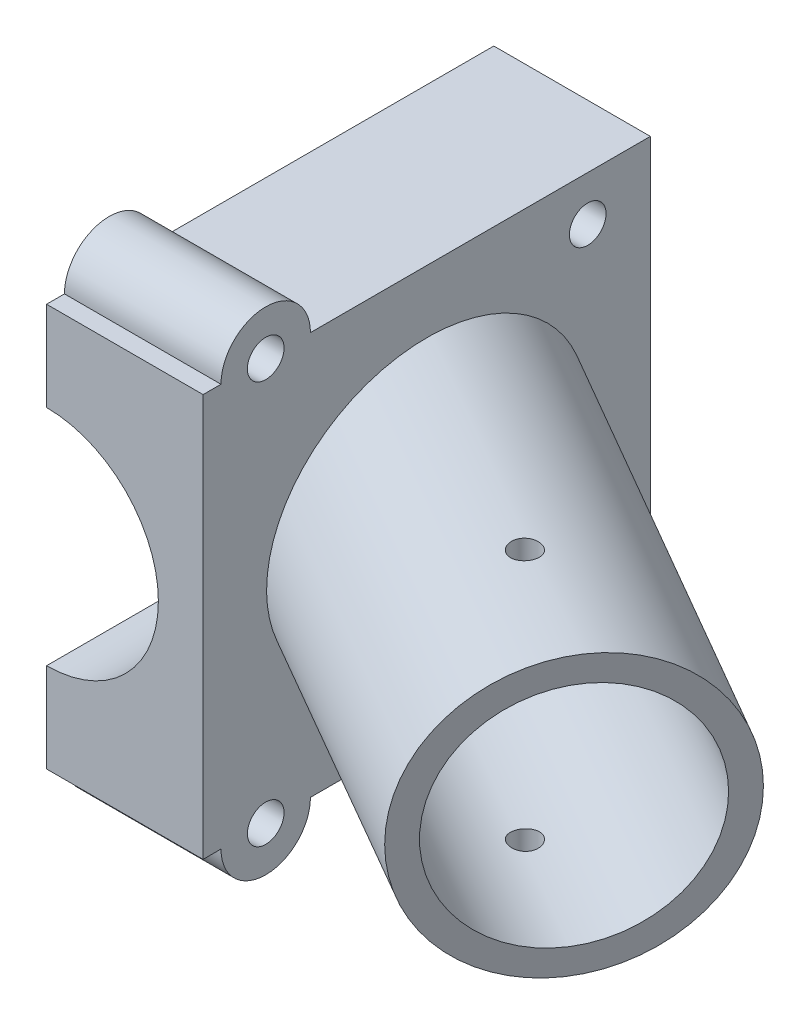
ISO-10303-21;
HEADER;
FILE_DESCRIPTION(('STEP AP214'),'2;1');
FILE_NAME('part.step','',(''),(''),'','','');
FILE_SCHEMA(('AUTOMOTIVE_DESIGN { 1 0 10303 214 1 1 1 1 }'));
ENDSEC;
DATA;
#1=APPLICATION_CONTEXT('core data for automotive mechanical design processes');
#2=APPLICATION_PROTOCOL_DEFINITION('international standard','automotive_design',2000,#1);
#3=PRODUCT_CONTEXT('',#1,'mechanical');
#4=PRODUCT('Part','Part','',(#3));
#5=PRODUCT_RELATED_PRODUCT_CATEGORY('part','',(#4));
#6=PRODUCT_DEFINITION_FORMATION('','',#4);
#7=PRODUCT_DEFINITION_CONTEXT('part definition',#1,'design');
#8=PRODUCT_DEFINITION('design','',#6,#7);
#9=PRODUCT_DEFINITION_SHAPE('','',#8);
#10=(LENGTH_UNIT() NAMED_UNIT(*) SI_UNIT(.MILLI.,.METRE.));
#11=(NAMED_UNIT(*) PLANE_ANGLE_UNIT() SI_UNIT($,.RADIAN.));
#12=(NAMED_UNIT(*) SI_UNIT($,.STERADIAN.) SOLID_ANGLE_UNIT());
#13=UNCERTAINTY_MEASURE_WITH_UNIT(LENGTH_MEASURE(1.E-05),#10,'distance_accuracy_value','');
#14=(GEOMETRIC_REPRESENTATION_CONTEXT(3) GLOBAL_UNCERTAINTY_ASSIGNED_CONTEXT((#13)) GLOBAL_UNIT_ASSIGNED_CONTEXT((#10,
#11,#12)) REPRESENTATION_CONTEXT('',''));
#15=CARTESIAN_POINT('',(0.,0.,0.));
#16=DIRECTION('',(0.,0.,1.));
#17=DIRECTION('',(1.,0.,0.));
#18=AXIS2_PLACEMENT_3D('',#15,#16,#17);
#19=CARTESIAN_POINT('',(-17.5,45.,25.));
#20=DIRECTION('',(0.,1.,0.));
#21=DIRECTION('',(0.,0.,1.));
#22=AXIS2_PLACEMENT_3D('',#19,#20,#21);
#23=PLANE('',#22);
#24=DIRECTION('',(0.,0.,1.));
#25=VECTOR('',#24,1.);
#26=CARTESIAN_POINT('',(0.,45.,-25.));
#27=LINE('',#26,#25);
#28=CARTESIAN_POINT('',(0.,45.,-25.));
#29=VERTEX_POINT('',#28);
#30=CARTESIAN_POINT('',(0.,45.,13.));
#31=VERTEX_POINT('',#30);
#32=EDGE_CURVE('E122',#29,#31,#27,.T.);
#33=ORIENTED_EDGE('',*,*,#32,.T.);
#34=DIRECTION('',(-1.,0.,0.));
#35=VECTOR('',#34,1.);
#36=CARTESIAN_POINT('',(17.5,45.,13.));
#37=LINE('',#36,#35);
#38=CARTESIAN_POINT('',(17.5,45.,13.));
#39=VERTEX_POINT('',#38);
#40=EDGE_CURVE('E52',#39,#31,#37,.T.);
#41=ORIENTED_EDGE('',*,*,#40,.F.);
#42=DIRECTION('',(0.,0.,-1.));
#43=VECTOR('',#42,1.);
#44=CARTESIAN_POINT('',(17.5,45.,25.));
#45=LINE('',#44,#43);
#46=CARTESIAN_POINT('',(17.5,45.,-25.));
#47=VERTEX_POINT('',#46);
#48=EDGE_CURVE('E284',#39,#47,#45,.T.);
#49=ORIENTED_EDGE('',*,*,#48,.T.);
#50=DIRECTION('',(1.,0.,0.));
#51=VECTOR('',#50,1.);
#52=CARTESIAN_POINT('',(-17.5,45.,-25.));
#53=LINE('',#52,#51);
#54=EDGE_CURVE('E240',#29,#47,#53,.T.);
#55=ORIENTED_EDGE('',*,*,#54,.F.);
#56=EDGE_LOOP('',(#33,#41,#49,#55));
#57=FACE_BOUND('',#56,.T.);
#58=ADVANCED_FACE('F35',(#57),#23,.T.);
#59=CARTESIAN_POINT('',(17.5,45.,25.));
#60=VERTEX_POINT('',#59);
#61=CARTESIAN_POINT('',(17.5,45.,23.));
#62=VERTEX_POINT('',#61);
#63=EDGE_CURVE('E60',#60,#62,#45,.T.);
#64=ORIENTED_EDGE('',*,*,#63,.T.);
#65=DIRECTION('',(-1.,0.,0.));
#66=VECTOR('',#65,1.);
#67=CARTESIAN_POINT('',(17.5,45.,23.));
#68=LINE('',#67,#66);
#69=CARTESIAN_POINT('',(0.,45.,23.));
#70=VERTEX_POINT('',#69);
#71=EDGE_CURVE('E126',#62,#70,#68,.T.);
#72=ORIENTED_EDGE('',*,*,#71,.T.);
#73=CARTESIAN_POINT('',(0.,45.,25.));
#74=VERTEX_POINT('',#73);
#75=EDGE_CURVE('E115',#70,#74,#27,.T.);
#76=ORIENTED_EDGE('',*,*,#75,.T.);
#77=DIRECTION('',(1.,0.,0.));
#78=VECTOR('',#77,1.);
#79=CARTESIAN_POINT('',(-17.5,45.,25.));
#80=LINE('',#79,#78);
#81=EDGE_CURVE('E286',#74,#60,#80,.T.);
#82=ORIENTED_EDGE('',*,*,#81,.T.);
#83=EDGE_LOOP('',(#64,#72,#76,#82));
#84=FACE_BOUND('',#83,.T.);
#85=ADVANCED_FACE('F127',(#84),#23,.T.);
#86=CARTESIAN_POINT('',(-17.5,0.,25.));
#87=DIRECTION('',(0.,1.,0.));
#88=DIRECTION('',(0.,0.,1.));
#89=AXIS2_PLACEMENT_3D('',#86,#87,#88);
#90=PLANE('',#89);
#91=DIRECTION('',(0.,0.,-1.));
#92=VECTOR('',#91,1.);
#93=CARTESIAN_POINT('',(17.5,0.,25.));
#94=LINE('',#93,#92);
#95=CARTESIAN_POINT('',(17.5,0.,13.));
#96=VERTEX_POINT('',#95);
#97=CARTESIAN_POINT('',(17.5,0.,-25.));
#98=VERTEX_POINT('',#97);
#99=EDGE_CURVE('E44',#96,#98,#94,.T.);
#100=ORIENTED_EDGE('',*,*,#99,.F.);
#101=DIRECTION('',(-1.,0.,0.));
#102=VECTOR('',#101,1.);
#103=CARTESIAN_POINT('',(17.5,0.,13.));
#104=LINE('',#103,#102);
#105=CARTESIAN_POINT('',(0.,0.,13.));
#106=VERTEX_POINT('',#105);
#107=EDGE_CURVE('E154',#96,#106,#104,.T.);
#108=ORIENTED_EDGE('',*,*,#107,.T.);
#109=DIRECTION('',(0.,0.,-1.));
#110=VECTOR('',#109,1.);
#111=CARTESIAN_POINT('',(0.,0.,-25.));
#112=LINE('',#111,#110);
#113=CARTESIAN_POINT('',(0.,0.,-25.));
#114=VERTEX_POINT('',#113);
#115=EDGE_CURVE('E164',#106,#114,#112,.T.);
#116=ORIENTED_EDGE('',*,*,#115,.T.);
#117=DIRECTION('',(1.,0.,0.));
#118=VECTOR('',#117,1.);
#119=CARTESIAN_POINT('',(-17.5,0.,-25.));
#120=LINE('',#119,#118);
#121=EDGE_CURVE('E258',#114,#98,#120,.T.);
#122=ORIENTED_EDGE('',*,*,#121,.T.);
#123=EDGE_LOOP('',(#100,#108,#116,#122));
#124=FACE_BOUND('',#123,.T.);
#125=ADVANCED_FACE('F237',(#124),#90,.F.);
#126=CARTESIAN_POINT('',(0.,0.,25.));
#127=VERTEX_POINT('',#126);
#128=CARTESIAN_POINT('',(0.,0.,23.));
#129=VERTEX_POINT('',#128);
#130=EDGE_CURVE('E165',#127,#129,#112,.T.);
#131=ORIENTED_EDGE('',*,*,#130,.T.);
#132=DIRECTION('',(-1.,0.,0.));
#133=VECTOR('',#132,1.);
#134=CARTESIAN_POINT('',(17.5,0.,23.));
#135=LINE('',#134,#133);
#136=CARTESIAN_POINT('',(17.5,0.,23.));
#137=VERTEX_POINT('',#136);
#138=EDGE_CURVE('E151',#137,#129,#135,.T.);
#139=ORIENTED_EDGE('',*,*,#138,.F.);
#140=CARTESIAN_POINT('',(17.5,0.,25.));
#141=VERTEX_POINT('',#140);
#142=EDGE_CURVE('E11',#141,#137,#94,.T.);
#143=ORIENTED_EDGE('',*,*,#142,.F.);
#144=DIRECTION('',(1.,0.,0.));
#145=VECTOR('',#144,1.);
#146=CARTESIAN_POINT('',(-17.5,0.,25.));
#147=LINE('',#146,#145);
#148=EDGE_CURVE('E253',#127,#141,#147,.T.);
#149=ORIENTED_EDGE('',*,*,#148,.F.);
#150=EDGE_LOOP('',(#131,#139,#143,#149));
#151=FACE_BOUND('',#150,.T.);
#152=ADVANCED_FACE('F37',(#151),#90,.F.);
#153=CARTESIAN_POINT('',(0.,22.5,25.));
#154=DIRECTION('',(0.,0.,-1.));
#155=DIRECTION('',(-1.,0.,0.));
#156=AXIS2_PLACEMENT_3D('',#153,#154,#155);
#157=CYLINDRICAL_SURFACE('',#156,12.5);
#158=DIRECTION('',(0.,0.,-1.));
#159=VECTOR('',#158,1.);
#160=CARTESIAN_POINT('',(0.,35.,25.));
#161=LINE('',#160,#159);
#162=CARTESIAN_POINT('',(0.,35.,-25.));
#163=VERTEX_POINT('',#162);
#164=CARTESIAN_POINT('',(0.,35.,25.));
#165=VERTEX_POINT('',#164);
#166=EDGE_CURVE('E172',#163,#165,#161,.F.);
#167=ORIENTED_EDGE('',*,*,#166,.F.);
#168=CARTESIAN_POINT('',(0.,22.5,-25.));
#169=DIRECTION('',(0.,0.,-1.));
#170=DIRECTION('',(1.,0.,0.));
#171=AXIS2_PLACEMENT_3D('',#168,#169,#170);
#172=CIRCLE('',#171,12.5);
#173=CARTESIAN_POINT('',(0.,10.,-25.));
#174=VERTEX_POINT('',#173);
#175=EDGE_CURVE('E248',#163,#174,#172,.T.);
#176=ORIENTED_EDGE('',*,*,#175,.T.);
#177=DIRECTION('',(0.,0.,-1.));
#178=VECTOR('',#177,1.);
#179=CARTESIAN_POINT('',(0.,10.,25.));
#180=LINE('',#179,#178);
#181=CARTESIAN_POINT('',(0.,10.,25.));
#182=VERTEX_POINT('',#181);
#183=EDGE_CURVE('E170',#182,#174,#180,.T.);
#184=ORIENTED_EDGE('',*,*,#183,.F.);
#185=CARTESIAN_POINT('',(0.,22.5,25.));
#186=DIRECTION('',(0.,0.,-1.));
#187=DIRECTION('',(1.,0.,0.));
#188=AXIS2_PLACEMENT_3D('',#185,#186,#187);
#189=CIRCLE('',#188,12.5);
#190=EDGE_CURVE('E264',#165,#182,#189,.T.);
#191=ORIENTED_EDGE('',*,*,#190,.F.);
#192=EDGE_LOOP('',(#167,#176,#184,#191));
#193=FACE_BOUND('',#192,.T.);
#194=ADVANCED_FACE('F422',(#193),#157,.F.);
#195=CARTESIAN_POINT('',(0.,22.5,25.));
#196=DIRECTION('',(0.,0.,1.));
#197=DIRECTION('',(1.,0.,0.));
#198=AXIS2_PLACEMENT_3D('',#195,#196,#197);
#199=PLANE('',#198);
#200=ORIENTED_EDGE('',*,*,#81,.F.);
#201=DIRECTION('',(0.,-1.,0.));
#202=VECTOR('',#201,1.);
#203=CARTESIAN_POINT('',(0.,45.,25.));
#204=LINE('',#203,#202);
#205=EDGE_CURVE('E120',#74,#165,#204,.T.);
#206=ORIENTED_EDGE('',*,*,#205,.T.);
#207=ORIENTED_EDGE('',*,*,#190,.T.);
#208=EDGE_CURVE('E162',#182,#127,#204,.T.);
#209=ORIENTED_EDGE('',*,*,#208,.T.);
#210=ORIENTED_EDGE('',*,*,#148,.T.);
#211=DIRECTION('',(0.,1.,0.));
#212=VECTOR('',#211,1.);
#213=CARTESIAN_POINT('',(17.5,0.,25.));
#214=LINE('',#213,#212);
#215=EDGE_CURVE('E256',#141,#60,#214,.T.);
#216=ORIENTED_EDGE('',*,*,#215,.T.);
#217=EDGE_LOOP('',(#200,#206,#207,#209,#210,#216));
#218=FACE_BOUND('',#217,.T.);
#219=ADVANCED_FACE('F431',(#218),#199,.T.);
#220=CARTESIAN_POINT('',(0.,22.5,-25.));
#221=DIRECTION('',(0.,0.,1.));
#222=DIRECTION('',(1.,0.,0.));
#223=AXIS2_PLACEMENT_3D('',#220,#221,#222);
#224=PLANE('',#223);
#225=DIRECTION('',(0.,1.,0.));
#226=VECTOR('',#225,1.);
#227=CARTESIAN_POINT('',(0.,45.,-25.));
#228=LINE('',#227,#226);
#229=EDGE_CURVE('E157',#163,#29,#228,.T.);
#230=ORIENTED_EDGE('',*,*,#229,.T.);
#231=ORIENTED_EDGE('',*,*,#54,.T.);
#232=DIRECTION('',(0.,1.,0.));
#233=VECTOR('',#232,1.);
#234=CARTESIAN_POINT('',(17.5,0.,-25.));
#235=LINE('',#234,#233);
#236=EDGE_CURVE('E254',#98,#47,#235,.T.);
#237=ORIENTED_EDGE('',*,*,#236,.F.);
#238=ORIENTED_EDGE('',*,*,#121,.F.);
#239=EDGE_CURVE('E123',#114,#174,#228,.T.);
#240=ORIENTED_EDGE('',*,*,#239,.T.);
#241=ORIENTED_EDGE('',*,*,#175,.F.);
#242=EDGE_LOOP('',(#230,#231,#237,#238,#240,#241));
#243=FACE_BOUND('',#242,.T.);
#244=ADVANCED_FACE('F229',(#243),#224,.F.);
#245=CARTESIAN_POINT('',(23.2982756057297,5.,-18.));
#246=DIRECTION('',(-1.,0.,0.));
#247=DIRECTION('',(0.,0.,1.));
#248=AXIS2_PLACEMENT_3D('',#245,#246,#247);
#249=CYLINDRICAL_SURFACE('',#248,2.05);
#250=CARTESIAN_POINT('',(17.5,5.,-18.));
#251=DIRECTION('',(-1.,0.,0.));
#252=DIRECTION('',(0.,0.,1.));
#253=AXIS2_PLACEMENT_3D('',#250,#251,#252);
#254=CIRCLE('',#253,2.05);
#255=CARTESIAN_POINT('',(17.5,5.,-15.95));
#256=VERTEX_POINT('',#255);
#257=EDGE_CURVE('E277',#256,#256,#254,.F.);
#258=ORIENTED_EDGE('',*,*,#257,.T.);
#259=EDGE_LOOP('',(#258));
#260=FACE_BOUND('',#259,.T.);
#261=CARTESIAN_POINT('',(0.,5.,-18.));
#262=DIRECTION('',(-1.,0.,0.));
#263=DIRECTION('',(0.,0.,1.));
#264=AXIS2_PLACEMENT_3D('',#261,#262,#263);
#265=CIRCLE('',#264,2.05);
#266=CARTESIAN_POINT('',(0.,5.,-15.95));
#267=VERTEX_POINT('',#266);
#268=EDGE_CURVE('E167',#267,#267,#265,.F.);
#269=ORIENTED_EDGE('',*,*,#268,.F.);
#270=EDGE_LOOP('',(#269));
#271=FACE_BOUND('',#270,.T.);
#272=ADVANCED_FACE('F226',(#260,#271),#249,.F.);
#273=CARTESIAN_POINT('',(23.2982756057297,40.,-18.));
#274=DIRECTION('',(-1.,0.,0.));
#275=DIRECTION('',(0.,0.,1.));
#276=AXIS2_PLACEMENT_3D('',#273,#274,#275);
#277=CYLINDRICAL_SURFACE('',#276,2.05);
#278=CARTESIAN_POINT('',(17.5,40.,-18.));
#279=DIRECTION('',(-1.,0.,0.));
#280=DIRECTION('',(0.,0.,1.));
#281=AXIS2_PLACEMENT_3D('',#278,#279,#280);
#282=CIRCLE('',#281,2.05);
#283=CARTESIAN_POINT('',(17.5,40.,-15.95));
#284=VERTEX_POINT('',#283);
#285=EDGE_CURVE('E287',#284,#284,#282,.T.);
#286=ORIENTED_EDGE('',*,*,#285,.F.);
#287=EDGE_LOOP('',(#286));
#288=FACE_BOUND('',#287,.T.);
#289=CARTESIAN_POINT('',(0.,40.,-18.));
#290=DIRECTION('',(-1.,0.,0.));
#291=DIRECTION('',(0.,0.,1.));
#292=AXIS2_PLACEMENT_3D('',#289,#290,#291);
#293=CIRCLE('',#292,2.05);
#294=CARTESIAN_POINT('',(0.,40.,-15.95));
#295=VERTEX_POINT('',#294);
#296=EDGE_CURVE('E39',#295,#295,#293,.T.);
#297=ORIENTED_EDGE('',*,*,#296,.T.);
#298=EDGE_LOOP('',(#297));
#299=FACE_BOUND('',#298,.T.);
#300=ADVANCED_FACE('F201',(#288,#299),#277,.F.);
#301=CARTESIAN_POINT('',(56.4711431702997,22.5,22.5000000000001));
#302=DIRECTION('',(-0.866025403784438,0.,-0.500000000000001));
#303=DIRECTION('',(-0.500000000000001,0.,0.866025403784438));
#304=AXIS2_PLACEMENT_3D('',#301,#302,#303);
#305=CYLINDRICAL_SURFACE('',#304,15.5);
#306=CARTESIAN_POINT('',(17.5,22.5,0.));
#307=DIRECTION('',(-1.,0.,0.));
#308=DIRECTION('',(0.,0.,1.));
#309=AXIS2_PLACEMENT_3D('',#306,#307,#308);
#310=ELLIPSE('',#309,17.8978583448784,15.5);
#311=CARTESIAN_POINT('',(17.5,22.5,17.8978583448784));
#312=VERTEX_POINT('',#311);
#313=EDGE_CURVE('E274',#312,#312,#310,.F.);
#314=ORIENTED_EDGE('',*,*,#313,.T.);
#315=EDGE_LOOP('',(#314));
#316=FACE_BOUND('',#315,.T.);
#317=CARTESIAN_POINT('',(56.4711431702997,22.5,22.5000000000001));
#318=DIRECTION('',(0.866025403784438,0.,0.500000000000001));
#319=DIRECTION('',(0.500000000000001,0.,-0.866025403784438));
#320=AXIS2_PLACEMENT_3D('',#317,#318,#319);
#321=CIRCLE('',#320,15.5);
#322=CARTESIAN_POINT('',(64.2211431702998,22.5,9.07660624134126));
#323=VERTEX_POINT('',#322);
#324=EDGE_CURVE('E271',#323,#323,#321,.T.);
#325=ORIENTED_EDGE('',*,*,#324,.F.);
#326=EDGE_LOOP('',(#325));
#327=FACE_BOUND('',#326,.T.);
#328=CARTESIAN_POINT('',(43.4807621135332,7.05823439499227,13.45));
#329=CARTESIAN_POINT('',(43.5675160446412,7.06200445649126,13.4500036016178));
#330=CARTESIAN_POINT('',(43.6543418891739,7.06541054031627,13.4573067217368));
#331=CARTESIAN_POINT('',(43.8256465243763,7.07110621943918,13.4863564332794));
#332=CARTESIAN_POINT('',(43.9101227727276,7.07339464658415,13.5081180806579));
#333=CARTESIAN_POINT('',(44.0742465063864,7.07659114623837,13.5654868670928));
#334=CARTESIAN_POINT('',(44.1538953047427,7.07749959572891,13.6010902215425));
#335=CARTESIAN_POINT('',(44.3060880113638,7.07783306564934,13.6851263754575));
#336=CARTESIAN_POINT('',(44.3786335190957,7.07725842083259,13.7335562775925));
#337=CARTESIAN_POINT('',(44.5144335890161,7.07469488583283,13.8417494876198));
#338=CARTESIAN_POINT('',(44.5777073023023,7.07270896179957,13.9014888330862));
#339=CARTESIAN_POINT('',(44.6933690898368,7.06755089204405,14.0306695876649));
#340=CARTESIAN_POINT('',(44.745756609908,7.06437868595545,14.1001114903987));
#341=CARTESIAN_POINT('',(44.8382952322347,7.05719658770184,14.246906673769));
#342=CARTESIAN_POINT('',(44.8784174384716,7.0531847543068,14.3242780721742));
#343=CARTESIAN_POINT('',(44.9451494389349,7.04477826922673,14.4846250099985));
#344=CARTESIAN_POINT('',(44.9717588717253,7.04038360730559,14.5676006992525));
#345=CARTESIAN_POINT('',(45.0108080054677,7.03168402215358,14.7372004519136));
#346=CARTESIAN_POINT('',(45.0231870476178,7.02737955930944,14.8238385133317));
#347=CARTESIAN_POINT('',(45.0332128219104,7.01936394758726,14.9979909007171));
#348=CARTESIAN_POINT('',(45.0308596272558,7.0156527957612,15.0855052223283));
#349=CARTESIAN_POINT('',(45.0114746721796,7.00924321461725,15.2588917867364));
#350=CARTESIAN_POINT('',(44.9944496669193,7.00654432005882,15.3447647666399));
#351=CARTESIAN_POINT('',(44.9461974124842,7.00246163206307,15.5124557596619));
#352=CARTESIAN_POINT('',(44.9149705842947,7.00107779964707,15.5942738928987));
#353=CARTESIAN_POINT('',(44.8393684781249,6.99978458374209,15.7511574289987));
#354=CARTESIAN_POINT('',(44.7950518362808,6.99986872003494,15.8262510400395));
#355=CARTESIAN_POINT('',(44.6944839744636,7.00148605822683,15.9679500169192));
#356=CARTESIAN_POINT('',(44.638232873644,7.0030192456591,16.0345554674933));
#357=CARTESIAN_POINT('',(44.5154966462151,7.00735936215163,16.1573012728042));
#358=CARTESIAN_POINT('',(44.4490269180169,7.01016438688166,16.2134570971696));
#359=CARTESIAN_POINT('',(44.3076743808161,7.01673479798779,16.3138614979084));
#360=CARTESIAN_POINT('',(44.2327913600437,7.02050020854068,16.3581097744635));
#361=CARTESIAN_POINT('',(44.0764217652082,7.02858788366574,16.43361634715));
#362=CARTESIAN_POINT('',(43.9949115860687,7.03291217428569,16.4648255405187));
#363=CARTESIAN_POINT('',(43.8278168933715,7.04162286731634,16.5131481389665));
#364=CARTESIAN_POINT('',(43.7422322903259,7.04600927108977,16.5302612342972));
#365=CARTESIAN_POINT('',(43.5691066248624,7.05436570279893,16.5499383954102));
#366=CARTESIAN_POINT('',(43.4815601850532,7.05833435558895,16.5524558007558));
#367=CARTESIAN_POINT('',(43.3072546845151,7.06538890514954,16.5427294082172));
#368=CARTESIAN_POINT('',(43.2204956106977,7.06847481662018,16.5304858561611));
#369=CARTESIAN_POINT('',(43.0504374107813,7.07340578851534,16.4916133858888));
#370=CARTESIAN_POINT('',(42.9671306928435,7.07525372383807,16.4650180575601));
#371=CARTESIAN_POINT('',(42.806149241979,7.07750883000158,16.3982101034457));
#372=CARTESIAN_POINT('',(42.7284743444037,7.07791604297911,16.3579978759506));
#373=CARTESIAN_POINT('',(42.581298127185,7.07724459697692,16.2653046747552));
#374=CARTESIAN_POINT('',(42.5117634868682,7.07617224282959,16.2128765460119));
#375=CARTESIAN_POINT('',(42.3824551992741,7.0726748535986,16.0971554452097));
#376=CARTESIAN_POINT('',(42.3226815940964,7.07024981268095,16.0338624262925));
#377=CARTESIAN_POINT('',(42.2145451050069,7.0643199554464,15.8981783336133));
#378=CARTESIAN_POINT('',(42.1661877596738,7.06081461691839,15.825782869811));
#379=CARTESIAN_POINT('',(42.0822608831935,7.05311876293306,15.6739573991863));
#380=CARTESIAN_POINT('',(42.0466917221584,7.04892822765007,15.5945271888492));
#381=CARTESIAN_POINT('',(41.9891961104724,7.04031112920313,15.4304859013959));
#382=CARTESIAN_POINT('',(41.9673311652019,7.03588359740341,15.3458533131905));
#383=CARTESIAN_POINT('',(41.9381099537546,7.02730696536937,15.1741044123299));
#384=CARTESIAN_POINT('',(41.930753858557,7.02315786841682,15.0869880704173));
#385=CARTESIAN_POINT('',(41.9307703943762,7.01559818405901,14.9125921841789));
#386=CARTESIAN_POINT('',(41.9381649988281,7.0121887068197,14.8253125901624));
#387=CARTESIAN_POINT('',(41.9675360461729,7.00650093719884,14.6532042557696));
#388=CARTESIAN_POINT('',(41.989512128812,7.00422261687306,14.5683754548975));
#389=CARTESIAN_POINT('',(42.0473236839823,7.00106084434852,14.4039097082219));
#390=CARTESIAN_POINT('',(42.0831069088429,7.00017219678131,14.324254496938));
#391=CARTESIAN_POINT('',(42.1675199423744,6.99987350176901,14.1720715298634));
#392=CARTESIAN_POINT('',(42.216149031839,7.00046337156129,14.0995433753592));
#393=CARTESIAN_POINT('',(42.3246832522864,7.00305079244081,13.963900250142));
#394=CARTESIAN_POINT('',(42.3845514305913,7.00504378767458,13.9007556132181));
#395=CARTESIAN_POINT('',(42.5139804675296,7.01021054790994,13.7853596336588));
#396=CARTESIAN_POINT('',(42.5835436369638,7.01338459471719,13.733110895494));
#397=CARTESIAN_POINT('',(42.7305821696545,7.02056947054891,13.640850544236));
#398=CARTESIAN_POINT('',(42.8080789735995,7.0245825993821,13.6008733248544));
#399=CARTESIAN_POINT('',(42.9685961378309,7.03298920705395,13.5344918648428));
#400=CARTESIAN_POINT('',(43.0516105918464,7.03738228065826,13.508073366618));
#401=CARTESIAN_POINT('',(43.1926675359693,7.04461496710974,13.4759056726032));
#402=CARTESIAN_POINT('',(43.2498388324123,7.0474855775232,13.4662050125253));
#403=CARTESIAN_POINT('',(43.3649167630199,7.0530363719589,13.45325095823));
#404=CARTESIAN_POINT('',(43.4228234006781,7.05571655507601,13.4499975946554));
#405=CARTESIAN_POINT('',(43.4807621135332,7.05823439499227,13.45));
#406=B_SPLINE_CURVE_WITH_KNOTS('',3,(#328,#329,#330,#331,#332,#333,#334,#335,#336,#337,#338,
#339,#340,#341,#342,#343,#344,#345,#346,#347,#348,#349,#350,#351,#352,#353,#354,#355,#356,#357,
#358,#359,#360,#361,#362,#363,#364,#365,#366,#367,#368,#369,#370,#371,#372,#373,#374,#375,#376,
#377,#378,#379,#380,#381,#382,#383,#384,#385,#386,#387,#388,#389,#390,#391,#392,#393,#394,#395,
#396,#397,#398,#399,#400,#401,#402,#403,#404,#405),.UNSPECIFIED.,.T.,.F.,(4,2,2,2,2,2,2,2,2,2,2,
2,2,2,2,2,2,2,2,2,2,2,2,2,2,2,2,2,2,2,2,2,2,2,2,2,2,2,4),(0.,0.260297661195021,
0.520866801288952,0.781364746485567,1.04180389910636,1.30169728765005,1.56160390319204,
1.82211819936283,2.08263946333009,2.34426716103638,2.60589355874337,2.86739956334388,
3.12889781661678,3.38924200216403,3.64958358856108,3.90953664454941,4.16949624524765,
4.43042616883806,4.69136182596447,4.95313120093368,5.21489621646925,5.47605121955319,
5.73719858458291,5.99723656095458,6.25727565884969,6.51744065619447,6.77761318255565,
7.03894517195475,7.30028024099609,7.56200489952363,7.82372309205459,8.08446047736363,
8.34518326776263,8.60506338994085,8.86500556080909,9.12566976304241,9.38605930082946,
9.55989856756679,9.73373866053076),.UNSPECIFIED.);
#407=CARTESIAN_POINT('',(43.4807621135332,7.05823439499227,13.45));
#408=VERTEX_POINT('',#407);
#409=EDGE_CURVE('E175',#408,#408,#406,.T.);
#410=ORIENTED_EDGE('',*,*,#409,.F.);
#411=EDGE_LOOP('',(#410));
#412=FACE_BOUND('',#411,.T.);
#413=CARTESIAN_POINT('',(43.4807621135332,37.9417656050077,13.45));
#414=CARTESIAN_POINT('',(43.3935974603184,37.9455545005548,13.4500036665922));
#415=CARTESIAN_POINT('',(43.3063905913797,37.9497155518943,13.4573763360214));
#416=CARTESIAN_POINT('',(43.1343998728757,37.9583128544061,13.4866726865872));
#417=CARTESIAN_POINT('',(43.049618906033,37.9627494146226,13.5086129859084));
#418=CARTESIAN_POINT('',(42.8849673274881,37.9713923702007,13.5664257559505));
#419=CARTESIAN_POINT('',(42.8050946455434,37.9755988625179,13.6022923054134));
#420=CARTESIAN_POINT('',(42.6525080664441,37.9833090102016,13.6869476394502));
#421=CARTESIAN_POINT('',(42.5797923846973,37.9868128410033,13.7357331914271));
#422=CARTESIAN_POINT('',(42.4436390297214,37.992721013919,13.8448048314286));
#423=CARTESIAN_POINT('',(42.3801918625688,37.9951264865504,13.9050790034381));
#424=CARTESIAN_POINT('',(42.2643089657803,37.9985716900008,14.035454422472));
#425=CARTESIAN_POINT('',(42.2118733207655,37.9996114103247,14.1055557450091));
#426=CARTESIAN_POINT('',(42.1197324569564,38.00020613453,14.25324679615));
#427=CARTESIAN_POINT('',(42.0799715475682,37.9997677342616,14.3308017611987));
#428=CARTESIAN_POINT('',(42.0139905682745,37.9974700623424,14.4914514331274));
#429=CARTESIAN_POINT('',(41.9877704038899,37.9956108006056,14.5745461013503));
#430=CARTESIAN_POINT('',(41.949615840167,37.9906817042402,14.7438458998377));
#431=CARTESIAN_POINT('',(41.9376699931422,37.9876128423146,14.8300484803869));
#432=CARTESIAN_POINT('',(41.9283421730897,37.9806066039696,15.0032029626374));
#433=CARTESIAN_POINT('',(41.9309605730853,37.9766692053074,15.0901548834741));
#434=CARTESIAN_POINT('',(41.9507144320952,37.9683466613513,15.2627316339504));
#435=CARTESIAN_POINT('',(41.9679089367867,37.9639597588186,15.3483496213303));
#436=CARTESIAN_POINT('',(42.0164067944969,37.9552429895248,15.515496182415));
#437=CARTESIAN_POINT('',(42.0477104210658,37.9509131238712,15.5970246767978));
#438=CARTESIAN_POINT('',(42.1236577369489,37.9427861633371,15.7539117250465));
#439=CARTESIAN_POINT('',(42.1683366517199,37.9389905146761,15.8292533088641));
#440=CARTESIAN_POINT('',(42.2697523050901,37.9323770621247,15.9713783683105));
#441=CARTESIAN_POINT('',(42.3264887877643,37.9295592374831,16.0381620255352));
#442=CARTESIAN_POINT('',(42.4502331467697,37.9252299948887,16.1610739799512));
#443=CARTESIAN_POINT('',(42.5172105885058,37.9237147913194,16.2172327810603));
#444=CARTESIAN_POINT('',(42.6596500978552,37.9221502168029,16.3175208650558));
#445=CARTESIAN_POINT('',(42.7351119382322,37.9221008066069,16.3616504700099));
#446=CARTESIAN_POINT('',(42.8920464340602,37.9234705919859,16.4364681625273));
#447=CARTESIAN_POINT('',(42.9734941016904,37.9248839722947,16.467208789707));
#448=CARTESIAN_POINT('',(43.1403498577677,37.9290098834292,16.5146426760625));
#449=CARTESIAN_POINT('',(43.2257579802362,37.931722425417,16.5313358145427));
#450=CARTESIAN_POINT('',(43.3982273097699,37.9381442787484,16.5502331814787));
#451=CARTESIAN_POINT('',(43.4852903707054,37.9418547776305,16.552420067848));
#452=CARTESIAN_POINT('',(43.6585315989417,37.9498541450557,16.5422152148759));
#453=CARTESIAN_POINT('',(43.7447097394985,37.9541430310239,16.5298230362247));
#454=CARTESIAN_POINT('',(43.9141586340965,37.9628394697753,16.4907251408877));
#455=CARTESIAN_POINT('',(43.9974146292782,37.9672474681965,16.4639555322948));
#456=CARTESIAN_POINT('',(44.158269133552,37.9756682666436,16.3968106243746));
#457=CARTESIAN_POINT('',(44.2358676132876,37.9796810646189,16.356435254454));
#458=CARTESIAN_POINT('',(44.3832703553485,37.9868633690554,16.2631671367565));
#459=CARTESIAN_POINT('',(44.4530683685239,37.9900322021663,16.2102644573585));
#460=CARTESIAN_POINT('',(44.5827989981998,37.9951645935377,16.0934500516433));
#461=CARTESIAN_POINT('',(44.6427318928711,37.9971281857872,16.029538635848));
#462=CARTESIAN_POINT('',(44.7507830359154,37.9996228157189,15.8928092394553));
#463=CARTESIAN_POINT('',(44.7989486544231,38.0001596860558,15.8200287981214));
#464=CARTESIAN_POINT('',(44.8824033518296,37.9997573132936,15.6674310674126));
#465=CARTESIAN_POINT('',(44.9176926643137,37.9988180969734,15.5876139057211));
#466=CARTESIAN_POINT('',(44.9743224809545,37.9955735378551,15.423436551611));
#467=CARTESIAN_POINT('',(44.9956989437754,37.9932717463949,15.3390886855401));
#468=CARTESIAN_POINT('',(45.0240627453687,37.9875619257823,15.1680440639065));
#469=CARTESIAN_POINT('',(45.0310497770456,37.9841538730221,15.0813472582532));
#470=CARTESIAN_POINT('',(45.0304554042546,37.9765996684683,14.9077831638841));
#471=CARTESIAN_POINT('',(45.0228314390009,37.9724513923825,14.820916115682));
#472=CARTESIAN_POINT('',(44.9931562688161,37.9638866378824,14.6496947601537));
#473=CARTESIAN_POINT('',(44.9711046533357,37.959470151839,14.5653405244026));
#474=CARTESIAN_POINT('',(44.9130749890745,37.9508455529372,14.401177285016));
#475=CARTESIAN_POINT('',(44.8770423445081,37.9466383308305,14.3213875248236));
#476=CARTESIAN_POINT('',(44.7920629844289,37.9389270514662,14.1689752416552));
#477=CARTESIAN_POINT('',(44.7431168295551,37.9354229636937,14.0963524077157));
#478=CARTESIAN_POINT('',(44.6337538682639,37.9295202156635,13.9604282433556));
#479=CARTESIAN_POINT('',(44.5733516656308,37.9271201612207,13.8971152255571));
#480=CARTESIAN_POINT('',(44.4427309505273,37.9236931193705,13.7815080653528));
#481=CARTESIAN_POINT('',(44.3725105396618,37.92266639791,13.7292160588241));
#482=CARTESIAN_POINT('',(44.2245850839574,37.9221053981416,13.6373629145057));
#483=CARTESIAN_POINT('',(44.1469114912403,37.9225650945718,13.5977510934227));
#484=CARTESIAN_POINT('',(43.986106874267,37.9249118678432,13.5321266950258));
#485=CARTESIAN_POINT('',(43.9029819368913,37.9267973766186,13.5060992311523));
#486=CARTESIAN_POINT('',(43.7629553528987,37.9309128793434,13.4748458627539));
#487=CARTESIAN_POINT('',(43.7069197952356,37.9327985905168,13.4655396007438));
#488=CARTESIAN_POINT('',(43.594182820979,37.9369922091572,13.4531154789943));
#489=CARTESIAN_POINT('',(43.5374814049407,37.9393001162721,13.4499976140958));
#490=CARTESIAN_POINT('',(43.4807621135332,37.9417656050077,13.45));
#491=B_SPLINE_CURVE_WITH_KNOTS('',3,(#413,#414,#415,#416,#417,#418,#419,#420,#421,#422,#423,
#424,#425,#426,#427,#428,#429,#430,#431,#432,#433,#434,#435,#436,#437,#438,#439,#440,#441,#442,
#443,#444,#445,#446,#447,#448,#449,#450,#451,#452,#453,#454,#455,#456,#457,#458,#459,#460,#461,
#462,#463,#464,#465,#466,#467,#468,#469,#470,#471,#472,#473,#474,#475,#476,#477,#478,#479,#480,
#481,#482,#483,#484,#485,#486,#487,#488,#489,#490),.UNSPECIFIED.,.T.,.F.,(4,2,2,2,2,2,2,2,2,2,2,
2,2,2,2,2,2,2,2,2,2,2,2,2,2,2,2,2,2,2,2,2,2,2,2,2,2,2,4),(0.,0.261533979975622,
0.523366821497165,0.785088456839278,1.0467446658898,1.30813094713426,1.56951923700182,
1.82974267464038,2.08996429657562,2.34997708616608,2.60999653530454,2.87107434648204,
3.13215721970451,3.39393382783078,3.65570488023404,3.91671258904303,4.17771330898709,
4.43768040167894,4.69764972797809,4.95792978921282,5.21821769364378,5.47967198061292,
5.74112762415405,6.00279124720675,6.26444749075961,6.52503238660879,6.78561255502976,
7.04551653408491,7.3054260598857,7.5660938343866,7.8267690267028,8.08847256741278,
8.35016474815272,8.61152554780795,8.87293695282644,9.1332900453323,9.39335722493601,
9.56354128283763,9.73372519886439),.UNSPECIFIED.);
#492=CARTESIAN_POINT('',(43.4807621135332,37.9417656050077,13.45));
#493=VERTEX_POINT('',#492);
#494=EDGE_CURVE('E183',#493,#493,#491,.T.);
#495=ORIENTED_EDGE('',*,*,#494,.F.);
#496=EDGE_LOOP('',(#495));
#497=FACE_BOUND('',#496,.T.);
#498=ADVANCED_FACE('F189',(#316,#327,#412,#497),#305,.T.);
#499=CARTESIAN_POINT('',(56.4711431702997,22.5,22.5000000000001));
#500=DIRECTION('',(-0.866025403784438,0.,-0.500000000000001));
#501=DIRECTION('',(-0.500000000000001,0.,0.866025403784438));
#502=AXIS2_PLACEMENT_3D('',#499,#500,#501);
#503=CYLINDRICAL_SURFACE('',#502,12.65);
#504=CARTESIAN_POINT('',(26.4230762113533,22.5,5.15174045262443));
#505=DIRECTION('',(0.866025403784439,0.,0.5));
#506=DIRECTION('',(0.5,0.,-0.866025403784439));
#507=AXIS2_PLACEMENT_3D('',#504,#505,#506);
#508=CIRCLE('',#507,12.65);
#509=CARTESIAN_POINT('',(32.7480762113533,22.5,-5.80348090524871));
#510=VERTEX_POINT('',#509);
#511=EDGE_CURVE('E280',#510,#510,#508,.T.);
#512=ORIENTED_EDGE('',*,*,#511,.F.);
#513=EDGE_LOOP('',(#512));
#514=FACE_BOUND('',#513,.T.);
#515=CARTESIAN_POINT('',(56.4711431702997,22.5,22.5000000000001));
#516=DIRECTION('',(-0.866025403784438,0.,-0.500000000000001));
#517=DIRECTION('',(0.500000000000001,0.,-0.866025403784438));
#518=AXIS2_PLACEMENT_3D('',#515,#516,#517);
#519=CIRCLE('',#518,12.65);
#520=CARTESIAN_POINT('',(62.7961431702997,22.5,11.5447786421269));
#521=VERTEX_POINT('',#520);
#522=EDGE_CURVE('E263',#521,#521,#519,.T.);
#523=ORIENTED_EDGE('',*,*,#522,.F.);
#524=EDGE_LOOP('',(#523));
#525=FACE_BOUND('',#524,.T.);
#526=CARTESIAN_POINT('',(43.4807621135332,9.92142198020779,13.45));
#527=CARTESIAN_POINT('',(43.3935468404104,9.91676796282501,13.4500035606448));
#528=CARTESIAN_POINT('',(43.3062998715242,9.91165801362198,13.4573844348063));
#529=CARTESIAN_POINT('',(43.1342406775248,9.90110330635436,13.486707184068));
#530=CARTESIAN_POINT('',(43.0494312665559,9.89565818244563,13.5086652353707));
#531=CARTESIAN_POINT('',(42.8847206825161,9.88505280242253,13.5665260176808));
#532=CARTESIAN_POINT('',(42.8048175721535,9.87989243395285,13.6024232031676));
#533=CARTESIAN_POINT('',(42.6521662279579,9.87043602193478,13.6871602045356));
#534=CARTESIAN_POINT('',(42.5794162038256,9.86613976183145,13.7359967705403));
#535=CARTESIAN_POINT('',(42.4432366899026,9.85890008412776,13.8451650838271));
#536=CARTESIAN_POINT('',(42.3797923297916,9.85595449180099,13.9054781295163));
#537=CARTESIAN_POINT('',(42.2639185179738,9.85173874053544,14.03594441536));
#538=CARTESIAN_POINT('',(42.2114889768441,9.85046856799448,14.1060975756208));
#539=CARTESIAN_POINT('',(42.1194763380893,9.8497499351183,14.253731657924));
#540=CARTESIAN_POINT('',(42.0798099669287,9.85028939231406,14.3311606369806));
#541=CARTESIAN_POINT('',(42.0139737253232,9.85310282083466,14.491527074379));
#542=CARTESIAN_POINT('',(41.9878037290352,9.85537677598617,14.574464481351));
#543=CARTESIAN_POINT('',(41.9497039965158,9.86140161217001,14.7433887543195));
#544=CARTESIAN_POINT('',(41.9377572985533,9.86515072691149,14.8293718619008));
#545=CARTESIAN_POINT('',(41.9283526379953,9.87371038087059,15.0020743777908));
#546=CARTESIAN_POINT('',(41.9308952363074,9.87852096117259,15.0887938144744));
#547=CARTESIAN_POINT('',(41.9504373518402,9.88870347301888,15.2610915135895));
#548=CARTESIAN_POINT('',(41.9675247717247,9.89407864318519,15.3466596169668));
#549=CARTESIAN_POINT('',(42.0157906071125,9.90476581695015,15.5137310247481));
#550=CARTESIAN_POINT('',(42.0469694332319,9.91007781870346,15.5952342106257));
#551=CARTESIAN_POINT('',(42.1227132609444,9.92006286924787,15.7522155928083));
#552=CARTESIAN_POINT('',(42.1673315213121,9.92473326618764,15.8276682768505));
#553=CARTESIAN_POINT('',(42.2686671718798,9.93287686791838,15.9700304681537));
#554=CARTESIAN_POINT('',(42.3253841759925,9.93635011090289,16.0369402479214));
#555=CARTESIAN_POINT('',(42.4490452332775,9.94168775013685,16.1600159199815));
#556=CARTESIAN_POINT('',(42.5159437088891,9.94355908160178,16.2162272978846));
#557=CARTESIAN_POINT('',(42.6582392349096,9.94550278299079,16.31663889226));
#558=CARTESIAN_POINT('',(42.7336359409643,9.94557522578073,16.3608395951655));
#559=CARTESIAN_POINT('',(42.8902873008702,9.9439180658727,16.4357339992132));
#560=CARTESIAN_POINT('',(42.9715042407577,9.9421992334106,16.4665068670524));
#561=CARTESIAN_POINT('',(43.1378850829693,9.93717207592984,16.5140746377082));
#562=CARTESIAN_POINT('',(43.2230490358216,9.93386373055773,16.5308693615295));
#563=CARTESIAN_POINT('',(43.3950791696598,9.92602437571101,16.5500524480761));
#564=CARTESIAN_POINT('',(43.4819480932063,9.92149121557421,16.552415295821));
#565=CARTESIAN_POINT('',(43.654824770759,9.91171339968909,16.5426271780928));
#566=CARTESIAN_POINT('',(43.7408324859063,9.90646871198958,16.5304755606556));
#567=CARTESIAN_POINT('',(43.9101818630299,9.89581528159494,16.491875131749));
#568=CARTESIAN_POINT('',(43.9935016286829,9.89040567093482,16.4653304353249));
#569=CARTESIAN_POINT('',(44.154529729758,9.88006329046655,16.398618032647));
#570=CARTESIAN_POINT('',(44.2322380179674,9.87513052467026,16.3584502117901));
#571=CARTESIAN_POINT('',(44.3799409544216,9.866289707434,16.2655427230904));
#572=CARTESIAN_POINT('',(44.4499258659739,9.86238294108283,16.2127874454321));
#573=CARTESIAN_POINT('',(44.5800559689355,9.85604361073708,16.096213014642));
#574=CARTESIAN_POINT('',(44.6402015796247,9.85361098391335,16.0323943331914));
#575=CARTESIAN_POINT('',(44.7485738664517,9.85050517247917,15.8959344259685));
#576=CARTESIAN_POINT('',(44.7968711680623,9.84982132135498,15.8233495280486));
#577=CARTESIAN_POINT('',(44.8806325692114,9.85025896221249,15.6711253965162));
#578=CARTESIAN_POINT('',(44.9160970124344,9.8513804058411,15.5914863518962));
#579=CARTESIAN_POINT('',(44.9730777394334,9.85529467742507,15.427759701252));
#580=CARTESIAN_POINT('',(44.9946483381244,9.85808091381687,15.343690825315));
#581=CARTESIAN_POINT('',(45.0234810552963,9.86500967766589,15.1731890998622));
#582=CARTESIAN_POINT('',(45.0307427420832,9.86915224603868,15.0867561791039));
#583=CARTESIAN_POINT('',(45.0307814908866,9.87835559476054,14.9135642201004));
#584=CARTESIAN_POINT('',(45.0234960878086,9.88342024967283,14.8268053790418));
#585=CARTESIAN_POINT('',(44.9945365810015,9.89389312982487,14.6557430332716));
#586=CARTESIAN_POINT('',(44.972861871252,9.89930136952638,14.5714396321294));
#587=CARTESIAN_POINT('',(44.9155532284129,9.90989128562061,14.4071348536204));
#588=CARTESIAN_POINT('',(44.879836951546,9.91507142135534,14.3271620786552));
#589=CARTESIAN_POINT('',(44.7954404430548,9.92458374610144,14.1743240756472));
#590=CARTESIAN_POINT('',(44.7467607917813,9.92891597305735,14.1014585296239));
#591=CARTESIAN_POINT('',(44.6378901471291,9.93623125996809,13.9650324941286));
#592=CARTESIAN_POINT('',(44.5777192535829,9.93921664552985,13.9014560943596));
#593=CARTESIAN_POINT('',(44.4474990342977,9.94350576127687,13.7852849873582));
#594=CARTESIAN_POINT('',(44.3774480732743,9.94480921271615,13.7326921016275));
#595=CARTESIAN_POINT('',(44.2299706933018,9.94558066666956,13.6403264695659));
#596=CARTESIAN_POINT('',(44.1525938238426,9.94506024766993,13.6004745967546));
#597=CARTESIAN_POINT('',(43.9923519340062,9.94226861999314,13.5343005422921));
#598=CARTESIAN_POINT('',(43.9094927435724,9.93999924466192,13.5079642410532));
#599=CARTESIAN_POINT('',(43.7686340474834,9.93497517848923,13.4758637387096));
#600=CARTESIAN_POINT('',(43.7114820159872,9.93262962253569,13.4661758244282));
#601=CARTESIAN_POINT('',(43.5964786783755,9.92739693831914,13.4532427736076));
#602=CARTESIAN_POINT('',(43.5386273722026,9.92450981001172,13.4499976375969));
#603=CARTESIAN_POINT('',(43.4807621135332,9.92142198020779,13.45));
#604=B_SPLINE_CURVE_WITH_KNOTS('',3,(#526,#527,#528,#529,#530,#531,#532,#533,#534,#535,#536,
#537,#538,#539,#540,#541,#542,#543,#544,#545,#546,#547,#548,#549,#550,#551,#552,#553,#554,#555,
#556,#557,#558,#559,#560,#561,#562,#563,#564,#565,#566,#567,#568,#569,#570,#571,#572,#573,#574,
#575,#576,#577,#578,#579,#580,#581,#582,#583,#584,#585,#586,#587,#588,#589,#590,#591,#592,#593,
#594,#595,#596,#597,#598,#599,#600,#601,#602,#603),.UNSPECIFIED.,.T.,.F.,(4,2,2,2,2,2,2,2,2,2,2,
2,2,2,2,2,2,2,2,2,2,2,2,2,2,2,2,2,2,2,2,2,2,2,2,2,2,2,4),(0.,0.261807020994568,0.52390505432793,
0.785898921696367,1.04782704852039,1.30933194792192,1.57083472423917,1.83059499300066,
2.09035283965901,2.34980060562866,2.60925841537442,2.87029550174545,3.13134019508825,
3.39343329865142,3.65551803972399,3.91646230465328,4.17739599974385,4.43676980469443,
4.69614693097195,4.9559824932206,5.21582972726272,5.47742969008249,5.73903185363812,
6.00096013406433,6.26287725008695,6.52319297184222,6.78350172140623,7.04278657410126,
7.30207924919164,7.56248771944855,7.82290715777121,8.08487711314205,8.34683534248118,
8.60833949778703,8.8698869864637,9.12977710768141,9.38939516864522,9.56309788384972,
9.73680061330161),.UNSPECIFIED.);
#605=CARTESIAN_POINT('',(43.4807621135332,9.92142198020779,13.45));
#606=VERTEX_POINT('',#605);
#607=EDGE_CURVE('E174',#606,#606,#604,.T.);
#608=ORIENTED_EDGE('',*,*,#607,.F.);
#609=EDGE_LOOP('',(#608));
#610=FACE_BOUND('',#609,.T.);
#611=CARTESIAN_POINT('',(43.4807621135332,35.0785780197922,13.45));
#612=CARTESIAN_POINT('',(43.567360070288,35.0739580998699,13.4500034550035));
#613=CARTESIAN_POINT('',(43.6540343327442,35.0697822449299,13.4572798769218));
#614=CARTESIAN_POINT('',(43.8250621027864,35.0627947984517,13.4862321011602));
#615=CARTESIAN_POINT('',(43.9094132973941,35.0599845233098,13.5079217501067));
#616=CARTESIAN_POINT('',(44.0733299176725,35.0560528528799,13.5651153564105));
#617=CARTESIAN_POINT('',(44.1528961540491,35.0549311707185,13.6006169659782));
#618=CARTESIAN_POINT('',(44.3049547530741,35.0545052505524,13.6844232798983));
#619=CARTESIAN_POINT('',(44.3774486294699,35.0552006227413,13.73272523624));
#620=CARTESIAN_POINT('',(44.5130970420331,35.0583228324338,13.8405740521052));
#621=CARTESIAN_POINT('',(44.5762807995211,35.060744106916,13.9000843320749));
#622=CARTESIAN_POINT('',(44.69182195113,35.0670373107824,14.0287576549703));
#623=CARTESIAN_POINT('',(44.7441787320339,35.0709093222984,14.0979212442673));
#624=CARTESIAN_POINT('',(44.8367854478677,35.0796841311319,14.2442083065549));
#625=CARTESIAN_POINT('',(44.8769922928769,35.0845904947693,14.3213588365849));
#626=CARTESIAN_POINT('',(44.943952895641,35.094876179865,14.4812641278635));
#627=CARTESIAN_POINT('',(44.9707061009528,35.1002555207345,14.5640191190884));
#628=CARTESIAN_POINT('',(45.0101489871073,35.1109229233132,14.7333846571527));
#629=CARTESIAN_POINT('',(45.0227475530256,35.1162101803584,14.8200164923409));
#630=CARTESIAN_POINT('',(45.0332050799154,35.1260636918992,14.9942071880705));
#631=CARTESIAN_POINT('',(45.0310641309985,35.1306299508026,15.0817660429412));
#632=CARTESIAN_POINT('',(45.0120832000976,35.1385250190377,15.2552785363011));
#633=CARTESIAN_POINT('',(44.9952526785728,35.1418546228397,15.3412331715653));
#634=CARTESIAN_POINT('',(44.9473589279851,35.1469041871821,15.5091303012552));
#635=CARTESIAN_POINT('',(44.9162963414511,35.1486242203783,15.5910729766223));
#636=CARTESIAN_POINT('',(44.841069411175,35.1502544351044,15.7480575220631));
#637=CARTESIAN_POINT('',(44.7969929524871,35.1501764947153,15.8231413940268));
#638=CARTESIAN_POINT('',(44.6969244932195,35.1482488622724,15.9648699555429));
#639=CARTESIAN_POINT('',(44.6409326709332,35.146399196728,16.0315147713478));
#640=CARTESIAN_POINT('',(44.5187811785082,35.1411413123001,16.1543403064309));
#641=CARTESIAN_POINT('',(44.4526450815671,35.137736671482,16.2105446343196));
#642=CARTESIAN_POINT('',(44.3119824694341,35.1297476130722,16.3111251305913));
#643=CARTESIAN_POINT('',(44.2374556455529,35.1251631520677,16.3555008636055));
#644=CARTESIAN_POINT('',(44.0816602962328,35.115293242445,16.4314230616226));
#645=CARTESIAN_POINT('',(44.0003567015444,35.1100040502278,16.462897073472));
#646=CARTESIAN_POINT('',(43.8336332757819,35.0993337039138,16.5117967787848));
#647=CARTESIAN_POINT('',(43.7482133057292,35.093952546716,16.5292219975745));
#648=CARTESIAN_POINT('',(43.5752085665865,35.083674835607,16.5495813848687));
#649=CARTESIAN_POINT('',(43.4876152873521,35.0787807667081,16.5524446404906));
#650=CARTESIAN_POINT('',(43.3131422429575,35.0700640741585,16.5433838543135));
#651=CARTESIAN_POINT('',(43.2262624602623,35.0662414240994,16.5314601770234));
#652=CARTESIAN_POINT('',(43.055989113588,35.0601171415706,16.4932032344253));
#653=CARTESIAN_POINT('',(42.9725846892842,35.0578103758864,16.466919157172));
#654=CARTESIAN_POINT('',(42.8113489491236,35.0549630182176,16.4007071095449));
#655=CARTESIAN_POINT('',(42.7335173860175,35.0544223478295,16.3607797449326));
#656=CARTESIAN_POINT('',(42.5861477202696,35.0551670249873,16.2687257095234));
#657=CARTESIAN_POINT('',(42.5165595219525,35.0564406569186,16.2166791078082));
#658=CARTESIAN_POINT('',(42.3870675108625,35.0606472969609,16.1017382700374));
#659=CARTESIAN_POINT('',(42.3271637541018,35.0635803146689,16.0388439712458));
#660=CARTESIAN_POINT('',(42.2186766598001,35.0707754954481,15.9039559974186));
#661=CARTESIAN_POINT('',(42.1701004094503,35.0750384867552,15.8319566689216));
#662=CARTESIAN_POINT('',(42.0856460276001,35.0844141582835,15.6809103282467));
#663=CARTESIAN_POINT('',(42.0497684487373,35.08952687547,15.6018630095324));
#664=CARTESIAN_POINT('',(41.9914945964144,35.1000682750652,15.4383653119789));
#665=CARTESIAN_POINT('',(41.9691901701503,35.1054988433696,15.3538823084823));
#666=CARTESIAN_POINT('',(41.9390646529012,35.1160358975918,15.182350799888));
#667=CARTESIAN_POINT('',(41.9312438196314,35.1211423777413,15.095302249168));
#668=CARTESIAN_POINT('',(41.9303225880096,35.1304704656562,14.9208704874585));
#669=CARTESIAN_POINT('',(41.9372569275605,35.1346899595076,14.8334869712603));
#670=CARTESIAN_POINT('',(41.965748494829,35.1417523802068,14.6610798269272));
#671=CARTESIAN_POINT('',(41.9873051691655,35.1445953591417,14.5760561096126));
#672=CARTESIAN_POINT('',(42.0442862418241,35.1485715052081,14.4112771493545));
#673=CARTESIAN_POINT('',(42.0796328896193,35.1497140885782,14.3314952483381));
#674=CARTESIAN_POINT('',(42.1631935321891,35.1501907725239,14.1789805847636));
#675=CARTESIAN_POINT('',(42.2114066933687,35.1495249902342,14.1062473659518));
#676=CARTESIAN_POINT('',(42.319047178632,35.1464678299455,13.9702409757607));
#677=CARTESIAN_POINT('',(42.3784186648744,35.1440848834549,13.9069233979892));
#678=CARTESIAN_POINT('',(42.5068530179194,35.1378671464302,13.7910828199824));
#679=CARTESIAN_POINT('',(42.5759181344885,35.1340320185116,13.7385623326067));
#680=CARTESIAN_POINT('',(42.72205125054,35.1253184982181,13.6456040682988));
#681=CARTESIAN_POINT('',(42.7991485834674,35.1204362076943,13.6052128301995));
#682=CARTESIAN_POINT('',(42.9589265649532,35.11018260023,13.5379164455805));
#683=CARTESIAN_POINT('',(43.0416016823537,35.1048117659604,13.5109981554682));
#684=CARTESIAN_POINT('',(43.1839885572211,35.0958318315764,13.4775040010747));
#685=CARTESIAN_POINT('',(43.2428506651734,35.0921940180531,13.4672058607922));
#686=CARTESIAN_POINT('',(43.3613837918747,35.085159775632,13.4534526478754));
#687=CARTESIAN_POINT('',(43.4210548156587,35.0817633482376,13.4499976178546));
#688=CARTESIAN_POINT('',(43.4807621135332,35.0785780197922,13.45));
#689=B_SPLINE_CURVE_WITH_KNOTS('',3,(#611,#612,#613,#614,#615,#616,#617,#618,#619,#620,#621,
#622,#623,#624,#625,#626,#627,#628,#629,#630,#631,#632,#633,#634,#635,#636,#637,#638,#639,#640,
#641,#642,#643,#644,#645,#646,#647,#648,#649,#650,#651,#652,#653,#654,#655,#656,#657,#658,#659,
#660,#661,#662,#663,#664,#665,#666,#667,#668,#669,#670,#671,#672,#673,#674,#675,#676,#677,#678,
#679,#680,#681,#682,#683,#684,#685,#686,#687,#688),.UNSPECIFIED.,.T.,.F.,(4,2,2,2,2,2,2,2,2,2,2,
2,2,2,2,2,2,2,2,2,2,2,2,2,2,2,2,2,2,2,2,2,2,2,2,2,2,2,4),(0.,0.259948032790148,
0.520146156482025,0.780300070396226,1.04039817899438,1.2996616944096,1.55893988993839,
1.81912710956951,2.07932501232739,2.34118840845626,2.60305020366007,2.86474347753389,
3.1264249380183,3.38637813168989,3.64632743587279,3.90568157586094,4.1650452604388,
4.42584615172894,4.68665585446632,4.94873442307659,5.2108065313859,5.4719865524832,
5.73315497870559,5.99264456959407,6.25213566125112,6.51178867362656,6.77145298453281,
7.0328554079243,7.29426248256029,7.55628566514319,7.81829893203104,8.07885578427678,
8.33939575967218,8.5986650902462,8.85799469369219,9.11830696830374,9.37836479674674,
9.55759186580436,9.73682005094082),.UNSPECIFIED.);
#690=CARTESIAN_POINT('',(43.4807621135332,35.0785780197922,13.45));
#691=VERTEX_POINT('',#690);
#692=EDGE_CURVE('E184',#691,#691,#689,.T.);
#693=ORIENTED_EDGE('',*,*,#692,.F.);
#694=EDGE_LOOP('',(#693));
#695=FACE_BOUND('',#694,.T.);
#696=ADVANCED_FACE('F214',(#514,#525,#610,#695),#503,.F.);
#697=CARTESIAN_POINT('',(17.5,0.,25.));
#698=DIRECTION('',(-1.,0.,0.));
#699=DIRECTION('',(0.,0.,1.));
#700=AXIS2_PLACEMENT_3D('',#697,#698,#699);
#701=PLANE('',#700);
#702=CARTESIAN_POINT('',(17.5,45.,18.));
#703=DIRECTION('',(-1.,0.,0.));
#704=DIRECTION('',(0.,0.,1.));
#705=AXIS2_PLACEMENT_3D('',#702,#703,#704);
#706=CIRCLE('',#705,2.05);
#707=CARTESIAN_POINT('',(17.5,45.,20.05));
#708=VERTEX_POINT('',#707);
#709=EDGE_CURVE('E134',#708,#708,#706,.T.);
#710=ORIENTED_EDGE('',*,*,#709,.T.);
#711=EDGE_LOOP('',(#710));
#712=FACE_BOUND('',#711,.T.);
#713=CARTESIAN_POINT('',(17.5,0.,18.));
#714=DIRECTION('',(-1.,0.,0.));
#715=DIRECTION('',(0.,0.,1.));
#716=AXIS2_PLACEMENT_3D('',#713,#714,#715);
#717=CIRCLE('',#716,2.05);
#718=CARTESIAN_POINT('',(17.5,0.,20.05));
#719=VERTEX_POINT('',#718);
#720=EDGE_CURVE('E144',#719,#719,#717,.F.);
#721=ORIENTED_EDGE('',*,*,#720,.F.);
#722=EDGE_LOOP('',(#721));
#723=FACE_BOUND('',#722,.T.);
#724=ORIENTED_EDGE('',*,*,#285,.T.);
#725=EDGE_LOOP('',(#724));
#726=FACE_BOUND('',#725,.T.);
#727=ORIENTED_EDGE('',*,*,#257,.F.);
#728=EDGE_LOOP('',(#727));
#729=FACE_BOUND('',#728,.T.);
#730=ORIENTED_EDGE('',*,*,#236,.T.);
#731=ORIENTED_EDGE('',*,*,#48,.F.);
#732=CARTESIAN_POINT('',(17.5,45.,18.));
#733=DIRECTION('',(1.,0.,0.));
#734=DIRECTION('',(0.,0.,-1.));
#735=AXIS2_PLACEMENT_3D('',#732,#733,#734);
#736=CIRCLE('',#735,5.);
#737=EDGE_CURVE('E133',#39,#62,#736,.T.);
#738=ORIENTED_EDGE('',*,*,#737,.T.);
#739=ORIENTED_EDGE('',*,*,#63,.F.);
#740=ORIENTED_EDGE('',*,*,#215,.F.);
#741=ORIENTED_EDGE('',*,*,#142,.T.);
#742=CARTESIAN_POINT('',(17.5,0.,18.));
#743=DIRECTION('',(-1.,0.,0.));
#744=DIRECTION('',(0.,0.,-1.));
#745=AXIS2_PLACEMENT_3D('',#742,#743,#744);
#746=CIRCLE('',#745,5.);
#747=EDGE_CURVE('E148',#96,#137,#746,.T.);
#748=ORIENTED_EDGE('',*,*,#747,.F.);
#749=ORIENTED_EDGE('',*,*,#99,.T.);
#750=EDGE_LOOP('',(#730,#731,#738,#739,#740,#741,#748,#749));
#751=FACE_BOUND('',#750,.T.);
#752=ORIENTED_EDGE('',*,*,#313,.F.);
#753=EDGE_LOOP('',(#752));
#754=FACE_BOUND('',#753,.T.);
#755=ADVANCED_FACE('F218',(#712,#723,#726,#729,#751,#754),#701,.F.);
#756=CARTESIAN_POINT('',(56.4711431702997,22.5,22.5000000000001));
#757=DIRECTION('',(0.866025403784438,0.,0.500000000000001));
#758=DIRECTION('',(0.500000000000001,0.,-0.866025403784438));
#759=AXIS2_PLACEMENT_3D('',#756,#757,#758);
#760=PLANE('',#759);
#761=ORIENTED_EDGE('',*,*,#324,.T.);
#762=EDGE_LOOP('',(#761));
#763=FACE_BOUND('',#762,.T.);
#764=ORIENTED_EDGE('',*,*,#522,.T.);
#765=EDGE_LOOP('',(#764));
#766=FACE_BOUND('',#765,.T.);
#767=ADVANCED_FACE('F220',(#763,#766),#760,.T.);
#768=CARTESIAN_POINT('',(26.4230762113533,22.5,5.15174045262443));
#769=DIRECTION('',(0.866025403784439,0.,0.5));
#770=DIRECTION('',(0.5,0.,-0.866025403784439));
#771=AXIS2_PLACEMENT_3D('',#768,#769,#770);
#772=PLANE('',#771);
#773=ORIENTED_EDGE('',*,*,#511,.T.);
#774=EDGE_LOOP('',(#773));
#775=FACE_BOUND('',#774,.T.);
#776=ADVANCED_FACE('F224',(#775),#772,.T.);
#777=CARTESIAN_POINT('',(43.4807621135332,45.,15.));
#778=DIRECTION('',(0.,-1.,0.));
#779=DIRECTION('',(0.,0.,-1.));
#780=AXIS2_PLACEMENT_3D('',#777,#778,#779);
#781=CYLINDRICAL_SURFACE('',#780,1.55);
#782=ORIENTED_EDGE('',*,*,#607,.T.);
#783=EDGE_LOOP('',(#782));
#784=FACE_BOUND('',#783,.T.);
#785=ORIENTED_EDGE('',*,*,#409,.T.);
#786=EDGE_LOOP('',(#785));
#787=FACE_BOUND('',#786,.T.);
#788=ADVANCED_FACE('F198',(#784,#787),#781,.F.);
#789=ORIENTED_EDGE('',*,*,#692,.T.);
#790=EDGE_LOOP('',(#789));
#791=FACE_BOUND('',#790,.T.);
#792=ORIENTED_EDGE('',*,*,#494,.T.);
#793=EDGE_LOOP('',(#792));
#794=FACE_BOUND('',#793,.T.);
#795=ADVANCED_FACE('F193',(#791,#794),#781,.F.);
#796=CARTESIAN_POINT('',(0.,0.,0.));
#797=DIRECTION('',(-1.,0.,0.));
#798=DIRECTION('',(0.,0.,1.));
#799=AXIS2_PLACEMENT_3D('',#796,#797,#798);
#800=PLANE('',#799);
#801=CARTESIAN_POINT('',(0.,45.,18.));
#802=DIRECTION('',(1.,0.,0.));
#803=DIRECTION('',(0.,0.,1.));
#804=AXIS2_PLACEMENT_3D('',#801,#802,#803);
#805=CIRCLE('',#804,2.05);
#806=CARTESIAN_POINT('',(0.,45.,20.05));
#807=VERTEX_POINT('',#806);
#808=EDGE_CURVE('E138',#807,#807,#805,.T.);
#809=ORIENTED_EDGE('',*,*,#808,.T.);
#810=EDGE_LOOP('',(#809));
#811=FACE_BOUND('',#810,.T.);
#812=ORIENTED_EDGE('',*,*,#296,.F.);
#813=EDGE_LOOP('',(#812));
#814=FACE_BOUND('',#813,.T.);
#815=ORIENTED_EDGE('',*,*,#166,.T.);
#816=ORIENTED_EDGE('',*,*,#205,.F.);
#817=ORIENTED_EDGE('',*,*,#75,.F.);
#818=CARTESIAN_POINT('',(0.,45.,18.));
#819=DIRECTION('',(1.,0.,0.));
#820=DIRECTION('',(0.,0.,-1.));
#821=AXIS2_PLACEMENT_3D('',#818,#819,#820);
#822=CIRCLE('',#821,5.);
#823=EDGE_CURVE('E118',#31,#70,#822,.T.);
#824=ORIENTED_EDGE('',*,*,#823,.F.);
#825=ORIENTED_EDGE('',*,*,#32,.F.);
#826=ORIENTED_EDGE('',*,*,#229,.F.);
#827=EDGE_LOOP('',(#815,#816,#817,#824,#825,#826));
#828=FACE_BOUND('',#827,.T.);
#829=ADVANCED_FACE('F116',(#811,#814,#828),#800,.T.);
#830=CARTESIAN_POINT('',(0.,0.,18.));
#831=DIRECTION('',(-1.,0.,0.));
#832=DIRECTION('',(0.,0.,1.));
#833=AXIS2_PLACEMENT_3D('',#830,#831,#832);
#834=CIRCLE('',#833,2.05);
#835=CARTESIAN_POINT('',(0.,0.,20.05));
#836=VERTEX_POINT('',#835);
#837=EDGE_CURVE('E130',#836,#836,#834,.T.);
#838=ORIENTED_EDGE('',*,*,#837,.F.);
#839=EDGE_LOOP('',(#838));
#840=FACE_BOUND('',#839,.T.);
#841=ORIENTED_EDGE('',*,*,#268,.T.);
#842=EDGE_LOOP('',(#841));
#843=FACE_BOUND('',#842,.T.);
#844=ORIENTED_EDGE('',*,*,#183,.T.);
#845=ORIENTED_EDGE('',*,*,#239,.F.);
#846=ORIENTED_EDGE('',*,*,#115,.F.);
#847=CARTESIAN_POINT('',(0.,0.,18.));
#848=DIRECTION('',(-1.,0.,0.));
#849=DIRECTION('',(0.,0.,-1.));
#850=AXIS2_PLACEMENT_3D('',#847,#848,#849);
#851=CIRCLE('',#850,5.);
#852=EDGE_CURVE('E147',#106,#129,#851,.T.);
#853=ORIENTED_EDGE('',*,*,#852,.T.);
#854=ORIENTED_EDGE('',*,*,#130,.F.);
#855=ORIENTED_EDGE('',*,*,#208,.F.);
#856=EDGE_LOOP('',(#844,#845,#846,#853,#854,#855));
#857=FACE_BOUND('',#856,.T.);
#858=ADVANCED_FACE('F330',(#840,#843,#857),#800,.T.);
#859=CARTESIAN_POINT('',(17.5,0.,18.));
#860=DIRECTION('',(-1.,0.,0.));
#861=DIRECTION('',(0.,0.,1.));
#862=AXIS2_PLACEMENT_3D('',#859,#860,#861);
#863=CYLINDRICAL_SURFACE('',#862,5.);
#864=ORIENTED_EDGE('',*,*,#852,.F.);
#865=ORIENTED_EDGE('',*,*,#107,.F.);
#866=ORIENTED_EDGE('',*,*,#747,.T.);
#867=ORIENTED_EDGE('',*,*,#138,.T.);
#868=EDGE_LOOP('',(#864,#865,#866,#867));
#869=FACE_BOUND('',#868,.T.);
#870=ADVANCED_FACE('F339',(#869),#863,.T.);
#871=CARTESIAN_POINT('',(23.2982756057297,0.,18.));
#872=DIRECTION('',(-1.,0.,0.));
#873=DIRECTION('',(0.,0.,1.));
#874=AXIS2_PLACEMENT_3D('',#871,#872,#873);
#875=CYLINDRICAL_SURFACE('',#874,2.05);
#876=ORIENTED_EDGE('',*,*,#720,.T.);
#877=EDGE_LOOP('',(#876));
#878=FACE_BOUND('',#877,.T.);
#879=ORIENTED_EDGE('',*,*,#837,.T.);
#880=EDGE_LOOP('',(#879));
#881=FACE_BOUND('',#880,.T.);
#882=ADVANCED_FACE('F347',(#878,#881),#875,.F.);
#883=CARTESIAN_POINT('',(17.5,45.,18.));
#884=DIRECTION('',(-1.,0.,0.));
#885=DIRECTION('',(0.,0.,1.));
#886=AXIS2_PLACEMENT_3D('',#883,#884,#885);
#887=CYLINDRICAL_SURFACE('',#886,5.);
#888=ORIENTED_EDGE('',*,*,#823,.T.);
#889=ORIENTED_EDGE('',*,*,#71,.F.);
#890=ORIENTED_EDGE('',*,*,#737,.F.);
#891=ORIENTED_EDGE('',*,*,#40,.T.);
#892=EDGE_LOOP('',(#888,#889,#890,#891));
#893=FACE_BOUND('',#892,.T.);
#894=ADVANCED_FACE('F132',(#893),#887,.T.);
#895=CARTESIAN_POINT('',(23.2982756057297,45.,18.));
#896=DIRECTION('',(-1.,0.,0.));
#897=DIRECTION('',(0.,0.,1.));
#898=AXIS2_PLACEMENT_3D('',#895,#896,#897);
#899=CYLINDRICAL_SURFACE('',#898,2.05);
#900=ORIENTED_EDGE('',*,*,#709,.F.);
#901=EDGE_LOOP('',(#900));
#902=FACE_BOUND('',#901,.T.);
#903=ORIENTED_EDGE('',*,*,#808,.F.);
#904=EDGE_LOOP('',(#903));
#905=FACE_BOUND('',#904,.T.);
#906=ADVANCED_FACE('F360',(#902,#905),#899,.F.);
#907=CLOSED_SHELL('',(#58,#85,#125,#152,#194,#219,#244,#272,#300,#498,#696,#755,#767,#776,#788,
#795,#829,#858,#870,#882,#894,#906));
#908=MANIFOLD_SOLID_BREP('B2',#907);
#909=ADVANCED_BREP_SHAPE_REPRESENTATION('',(#18,#908),#14);
#910=SHAPE_DEFINITION_REPRESENTATION(#9,#909);
ENDSEC;
END-ISO-10303-21;
